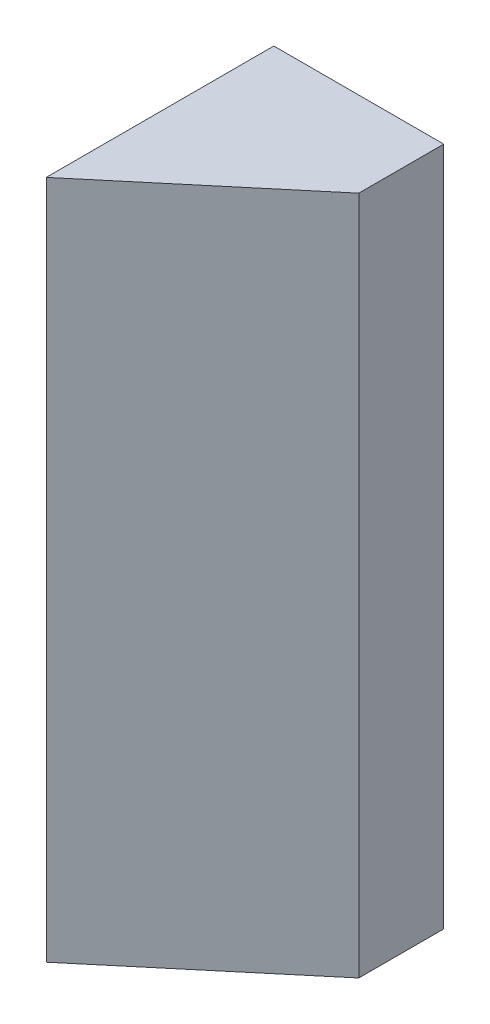
ISO-10303-21;
HEADER;
FILE_DESCRIPTION(('STEP AP214'),'2;1');
FILE_NAME('part.step','',(''),(''),'','','');
FILE_SCHEMA(('AUTOMOTIVE_DESIGN { 1 0 10303 214 1 1 1 1 }'));
ENDSEC;
DATA;
#1=APPLICATION_CONTEXT('core data for automotive mechanical design processes');
#2=APPLICATION_PROTOCOL_DEFINITION('international standard','automotive_design',2000,#1);
#3=PRODUCT_CONTEXT('',#1,'mechanical');
#4=PRODUCT('Part','Part','',(#3));
#5=PRODUCT_RELATED_PRODUCT_CATEGORY('part','',(#4));
#6=PRODUCT_DEFINITION_FORMATION('','',#4);
#7=PRODUCT_DEFINITION_CONTEXT('part definition',#1,'design');
#8=PRODUCT_DEFINITION('design','',#6,#7);
#9=PRODUCT_DEFINITION_SHAPE('','',#8);
#10=(LENGTH_UNIT() NAMED_UNIT(*) SI_UNIT(.MILLI.,.METRE.));
#11=(NAMED_UNIT(*) PLANE_ANGLE_UNIT() SI_UNIT($,.RADIAN.));
#12=(NAMED_UNIT(*) SI_UNIT($,.STERADIAN.) SOLID_ANGLE_UNIT());
#13=UNCERTAINTY_MEASURE_WITH_UNIT(LENGTH_MEASURE(1.E-05),#10,'distance_accuracy_value','');
#14=(GEOMETRIC_REPRESENTATION_CONTEXT(3) GLOBAL_UNCERTAINTY_ASSIGNED_CONTEXT((#13)) GLOBAL_UNIT_ASSIGNED_CONTEXT((#10,
#11,#12)) REPRESENTATION_CONTEXT('',''));
#15=CARTESIAN_POINT('',(0.,0.,0.));
#16=DIRECTION('',(0.,0.,1.));
#17=DIRECTION('',(1.,0.,0.));
#18=AXIS2_PLACEMENT_3D('',#15,#16,#17);
#19=CARTESIAN_POINT('',(3.175,12.7,3.175));
#20=DIRECTION('',(-1.,0.,0.));
#21=DIRECTION('',(0.,-1.,0.));
#22=AXIS2_PLACEMENT_3D('',#19,#20,#21);
#23=PLANE('',#22);
#24=DIRECTION('',(0.,1.,0.));
#25=VECTOR('',#24,1.);
#26=CARTESIAN_POINT('',(3.175,12.7,0.));
#27=LINE('',#26,#25);
#28=CARTESIAN_POINT('',(3.175,-12.7,0.));
#29=VERTEX_POINT('',#28);
#30=CARTESIAN_POINT('',(3.175,12.7,0.));
#31=VERTEX_POINT('',#30);
#32=EDGE_CURVE('E94',#29,#31,#27,.T.);
#33=ORIENTED_EDGE('',*,*,#32,.T.);
#34=DIRECTION('',(0.,0.,-1.));
#35=VECTOR('',#34,1.);
#36=CARTESIAN_POINT('',(3.175,12.7,3.175));
#37=LINE('',#36,#35);
#38=CARTESIAN_POINT('',(3.175,12.7,3.175));
#39=VERTEX_POINT('',#38);
#40=EDGE_CURVE('E11',#39,#31,#37,.T.);
#41=ORIENTED_EDGE('',*,*,#40,.F.);
#42=DIRECTION('',(0.,1.,0.));
#43=VECTOR('',#42,1.);
#44=CARTESIAN_POINT('',(3.175,12.7,3.175));
#45=LINE('',#44,#43);
#46=CARTESIAN_POINT('',(3.175,-12.7,3.175));
#47=VERTEX_POINT('',#46);
#48=EDGE_CURVE('E95',#47,#39,#45,.T.);
#49=ORIENTED_EDGE('',*,*,#48,.F.);
#50=DIRECTION('',(0.,0.,-1.));
#51=VECTOR('',#50,1.);
#52=CARTESIAN_POINT('',(3.175,-12.7,3.175));
#53=LINE('',#52,#51);
#54=EDGE_CURVE('E90',#47,#29,#53,.T.);
#55=ORIENTED_EDGE('',*,*,#54,.T.);
#56=EDGE_LOOP('',(#33,#41,#49,#55));
#57=FACE_BOUND('',#56,.T.);
#58=ADVANCED_FACE('F39',(#57),#23,.F.);
#59=CARTESIAN_POINT('',(-3.175,12.7,3.175));
#60=DIRECTION('',(0.,-1.,0.));
#61=DIRECTION('',(0.,0.,-1.));
#62=AXIS2_PLACEMENT_3D('',#59,#60,#61);
#63=PLANE('',#62);
#64=DIRECTION('',(-1.,0.,0.));
#65=VECTOR('',#64,1.);
#66=CARTESIAN_POINT('',(-3.175,12.7,0.));
#67=LINE('',#66,#65);
#68=CARTESIAN_POINT('',(-3.175,12.7,0.));
#69=VERTEX_POINT('',#68);
#70=EDGE_CURVE('E81',#31,#69,#67,.T.);
#71=ORIENTED_EDGE('',*,*,#70,.T.);
#72=DIRECTION('',(0.,0.,-1.));
#73=VECTOR('',#72,1.);
#74=CARTESIAN_POINT('',(-3.175,12.7,3.175));
#75=LINE('',#74,#73);
#76=CARTESIAN_POINT('',(-3.175,12.7,8.50328265797567));
#77=VERTEX_POINT('',#76);
#78=EDGE_CURVE('E47',#77,#69,#75,.T.);
#79=ORIENTED_EDGE('',*,*,#78,.F.);
#80=DIRECTION('',(0.766044443118982,0.,-0.642787609686535));
#81=VECTOR('',#80,1.);
#82=CARTESIAN_POINT('',(-3.175,12.7,8.50328265797567));
#83=LINE('',#82,#81);
#84=EDGE_CURVE('E107',#77,#39,#83,.T.);
#85=ORIENTED_EDGE('',*,*,#84,.T.);
#86=ORIENTED_EDGE('',*,*,#40,.T.);
#87=EDGE_LOOP('',(#71,#79,#85,#86));
#88=FACE_BOUND('',#87,.T.);
#89=ADVANCED_FACE('F115',(#88),#63,.F.);
#90=CARTESIAN_POINT('',(-3.175,12.7,3.175));
#91=DIRECTION('',(1.,0.,0.));
#92=DIRECTION('',(0.,1.,0.));
#93=AXIS2_PLACEMENT_3D('',#90,#91,#92);
#94=PLANE('',#93);
#95=DIRECTION('',(0.,-1.,0.));
#96=VECTOR('',#95,1.);
#97=CARTESIAN_POINT('',(-3.175,12.7,0.));
#98=LINE('',#97,#96);
#99=CARTESIAN_POINT('',(-3.175,-12.7,0.));
#100=VERTEX_POINT('',#99);
#101=EDGE_CURVE('E70',#69,#100,#98,.T.);
#102=ORIENTED_EDGE('',*,*,#101,.T.);
#103=DIRECTION('',(0.,0.,-1.));
#104=VECTOR('',#103,1.);
#105=CARTESIAN_POINT('',(-3.175,-12.7,3.175));
#106=LINE('',#105,#104);
#107=CARTESIAN_POINT('',(-3.175,-12.7,8.50328265797567));
#108=VERTEX_POINT('',#107);
#109=EDGE_CURVE('E75',#108,#100,#106,.T.);
#110=ORIENTED_EDGE('',*,*,#109,.F.);
#111=DIRECTION('',(0.,1.,0.));
#112=VECTOR('',#111,1.);
#113=CARTESIAN_POINT('',(-3.175,-20.9893362872599,8.50328265797567));
#114=LINE('',#113,#112);
#115=EDGE_CURVE('E104',#108,#77,#114,.T.);
#116=ORIENTED_EDGE('',*,*,#115,.T.);
#117=ORIENTED_EDGE('',*,*,#78,.T.);
#118=EDGE_LOOP('',(#102,#110,#116,#117));
#119=FACE_BOUND('',#118,.T.);
#120=ADVANCED_FACE('F72',(#119),#94,.F.);
#121=CARTESIAN_POINT('',(-3.175,-12.7,3.175));
#122=DIRECTION('',(0.,1.,0.));
#123=DIRECTION('',(0.,0.,1.));
#124=AXIS2_PLACEMENT_3D('',#121,#122,#123);
#125=PLANE('',#124);
#126=DIRECTION('',(1.,0.,0.));
#127=VECTOR('',#126,1.);
#128=CARTESIAN_POINT('',(-3.175,-12.7,0.));
#129=LINE('',#128,#127);
#130=EDGE_CURVE('E80',#100,#29,#129,.T.);
#131=ORIENTED_EDGE('',*,*,#130,.T.);
#132=ORIENTED_EDGE('',*,*,#54,.F.);
#133=DIRECTION('',(-0.766044443118982,0.,0.642787609686535));
#134=VECTOR('',#133,1.);
#135=CARTESIAN_POINT('',(-3.175,-12.7,8.50328265797567));
#136=LINE('',#135,#134);
#137=EDGE_CURVE('E88',#47,#108,#136,.T.);
#138=ORIENTED_EDGE('',*,*,#137,.T.);
#139=ORIENTED_EDGE('',*,*,#109,.T.);
#140=EDGE_LOOP('',(#131,#132,#138,#139));
#141=FACE_BOUND('',#140,.T.);
#142=ADVANCED_FACE('F84',(#141),#125,.F.);
#143=CARTESIAN_POINT('',(0.,0.,0.));
#144=DIRECTION('',(0.,0.,1.));
#145=DIRECTION('',(1.,0.,0.));
#146=AXIS2_PLACEMENT_3D('',#143,#144,#145);
#147=PLANE('',#146);
#148=CARTESIAN_POINT('',(0.,4.23333333333333,0.));
#149=DIRECTION('',(0.,0.,-1.));
#150=DIRECTION('',(-1.,0.,0.));
#151=AXIS2_PLACEMENT_3D('',#148,#149,#150);
#152=CIRCLE('',#151,1.5875);
#153=CARTESIAN_POINT('',(-1.5875,4.23333333333333,0.));
#154=VERTEX_POINT('',#153);
#155=EDGE_CURVE('E151',#154,#154,#152,.T.);
#156=ORIENTED_EDGE('',*,*,#155,.F.);
#157=EDGE_LOOP('',(#156));
#158=FACE_BOUND('',#157,.T.);
#159=CARTESIAN_POINT('',(0.,-4.23333333333333,0.));
#160=DIRECTION('',(0.,0.,-1.));
#161=DIRECTION('',(-1.,0.,0.));
#162=AXIS2_PLACEMENT_3D('',#159,#160,#161);
#163=CIRCLE('',#162,1.5875);
#164=CARTESIAN_POINT('',(-1.5875,-4.23333333333333,0.));
#165=VERTEX_POINT('',#164);
#166=EDGE_CURVE('E154',#165,#165,#163,.T.);
#167=ORIENTED_EDGE('',*,*,#166,.F.);
#168=EDGE_LOOP('',(#167));
#169=FACE_BOUND('',#168,.T.);
#170=ORIENTED_EDGE('',*,*,#32,.F.);
#171=ORIENTED_EDGE('',*,*,#130,.F.);
#172=ORIENTED_EDGE('',*,*,#101,.F.);
#173=ORIENTED_EDGE('',*,*,#70,.F.);
#174=EDGE_LOOP('',(#170,#171,#172,#173));
#175=FACE_BOUND('',#174,.T.);
#176=ADVANCED_FACE('F93',(#158,#169,#175),#147,.F.);
#177=CARTESIAN_POINT('',(-3.175,-20.9893362872599,8.50328265797567));
#178=DIRECTION('',(0.642787609686535,0.,0.766044443118982));
#179=DIRECTION('',(0.766044443118982,0.,-0.642787609686535));
#180=AXIS2_PLACEMENT_3D('',#177,#178,#179);
#181=PLANE('',#180);
#182=ORIENTED_EDGE('',*,*,#137,.F.);
#183=ORIENTED_EDGE('',*,*,#48,.T.);
#184=ORIENTED_EDGE('',*,*,#84,.F.);
#185=ORIENTED_EDGE('',*,*,#115,.F.);
#186=EDGE_LOOP('',(#182,#183,#184,#185));
#187=FACE_BOUND('',#186,.T.);
#188=ADVANCED_FACE('F101',(#187),#181,.T.);
#189=CARTESIAN_POINT('',(0.,-4.23333333333333,3.175));
#190=DIRECTION('',(0.,0.,-1.));
#191=DIRECTION('',(-1.,0.,0.));
#192=AXIS2_PLACEMENT_3D('',#189,#190,#191);
#193=CYLINDRICAL_SURFACE('',#192,1.5875);
#194=CARTESIAN_POINT('',(0.,-4.23333333333333,3.175));
#195=DIRECTION('',(0.,0.,-1.));
#196=DIRECTION('',(-1.,0.,0.));
#197=AXIS2_PLACEMENT_3D('',#194,#195,#196);
#198=CIRCLE('',#197,1.5875);
#199=CARTESIAN_POINT('',(-1.5875,-4.23333333333333,3.175));
#200=VERTEX_POINT('',#199);
#201=EDGE_CURVE('E111',#200,#200,#198,.T.);
#202=ORIENTED_EDGE('',*,*,#201,.F.);
#203=EDGE_LOOP('',(#202));
#204=FACE_BOUND('',#203,.T.);
#205=ORIENTED_EDGE('',*,*,#166,.T.);
#206=EDGE_LOOP('',(#205));
#207=FACE_BOUND('',#206,.T.);
#208=ADVANCED_FACE('F132',(#204,#207),#193,.F.);
#209=CARTESIAN_POINT('',(0.,-4.23333333333333,3.175));
#210=DIRECTION('',(0.,0.,-1.));
#211=DIRECTION('',(-1.,0.,0.));
#212=AXIS2_PLACEMENT_3D('',#209,#210,#211);
#213=PLANE('',#212);
#214=ORIENTED_EDGE('',*,*,#201,.T.);
#215=EDGE_LOOP('',(#214));
#216=FACE_BOUND('',#215,.T.);
#217=ADVANCED_FACE('F133',(#216),#213,.T.);
#218=CARTESIAN_POINT('',(0.,4.23333333333333,3.175));
#219=DIRECTION('',(0.,0.,-1.));
#220=DIRECTION('',(-1.,0.,0.));
#221=AXIS2_PLACEMENT_3D('',#218,#219,#220);
#222=CYLINDRICAL_SURFACE('',#221,1.5875);
#223=CARTESIAN_POINT('',(0.,4.23333333333333,3.175));
#224=DIRECTION('',(0.,0.,-1.));
#225=DIRECTION('',(-1.,0.,0.));
#226=AXIS2_PLACEMENT_3D('',#223,#224,#225);
#227=CIRCLE('',#226,1.5875);
#228=CARTESIAN_POINT('',(-1.5875,4.23333333333333,3.175));
#229=VERTEX_POINT('',#228);
#230=EDGE_CURVE('E113',#229,#229,#227,.T.);
#231=ORIENTED_EDGE('',*,*,#230,.F.);
#232=EDGE_LOOP('',(#231));
#233=FACE_BOUND('',#232,.T.);
#234=ORIENTED_EDGE('',*,*,#155,.T.);
#235=EDGE_LOOP('',(#234));
#236=FACE_BOUND('',#235,.T.);
#237=ADVANCED_FACE('F136',(#233,#236),#222,.F.);
#238=CARTESIAN_POINT('',(0.,4.23333333333333,3.175));
#239=DIRECTION('',(0.,0.,-1.));
#240=DIRECTION('',(-1.,0.,0.));
#241=AXIS2_PLACEMENT_3D('',#238,#239,#240);
#242=PLANE('',#241);
#243=ORIENTED_EDGE('',*,*,#230,.T.);
#244=EDGE_LOOP('',(#243));
#245=FACE_BOUND('',#244,.T.);
#246=ADVANCED_FACE('F143',(#245),#242,.T.);
#247=CLOSED_SHELL('',(#58,#89,#120,#142,#176,#188,#208,#217,#237,#246));
#248=MANIFOLD_SOLID_BREP('B2',#247);
#249=ADVANCED_BREP_SHAPE_REPRESENTATION('',(#18,#248),#14);
#250=SHAPE_DEFINITION_REPRESENTATION(#9,#249);
ENDSEC;
END-ISO-10303-21;
